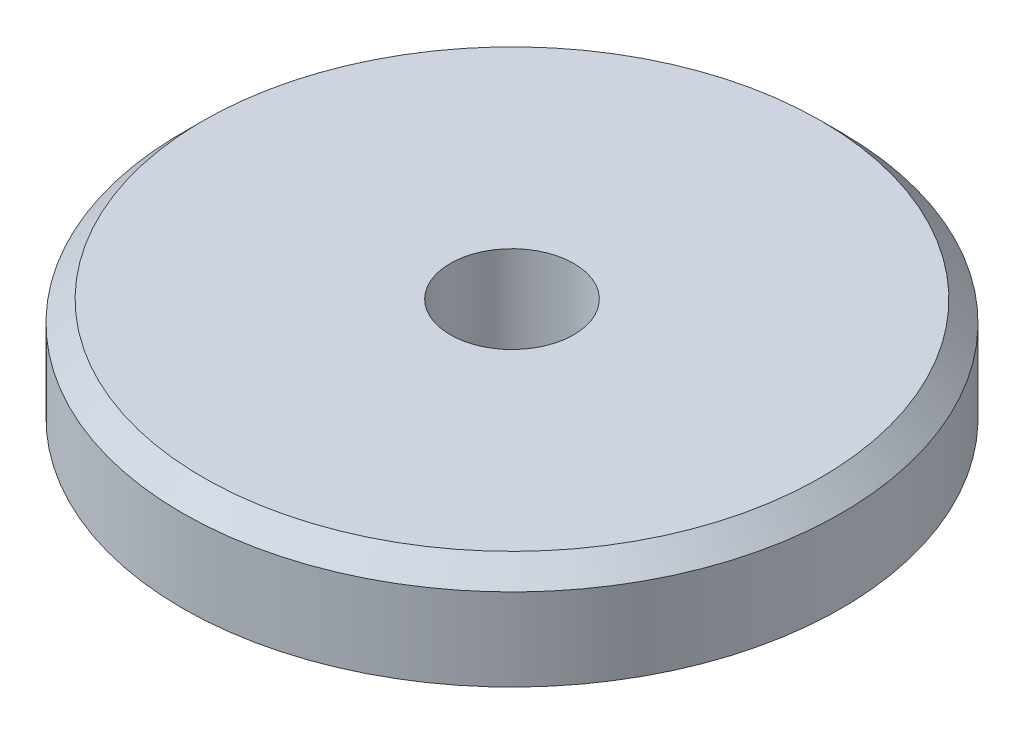
ISO-10303-21;
HEADER;
FILE_DESCRIPTION(('STEP AP214'),'2;1');
FILE_NAME('part.step','',(''),(''),'','','');
FILE_SCHEMA(('AUTOMOTIVE_DESIGN { 1 0 10303 214 1 1 1 1 }'));
ENDSEC;
DATA;
#1=APPLICATION_CONTEXT('core data for automotive mechanical design processes');
#2=APPLICATION_PROTOCOL_DEFINITION('international standard','automotive_design',2000,#1);
#3=PRODUCT_CONTEXT('',#1,'mechanical');
#4=PRODUCT('Part','Part','',(#3));
#5=PRODUCT_RELATED_PRODUCT_CATEGORY('part','',(#4));
#6=PRODUCT_DEFINITION_FORMATION('','',#4);
#7=PRODUCT_DEFINITION_CONTEXT('part definition',#1,'design');
#8=PRODUCT_DEFINITION('design','',#6,#7);
#9=PRODUCT_DEFINITION_SHAPE('','',#8);
#10=(LENGTH_UNIT() NAMED_UNIT(*) SI_UNIT(.MILLI.,.METRE.));
#11=(NAMED_UNIT(*) PLANE_ANGLE_UNIT() SI_UNIT($,.RADIAN.));
#12=(NAMED_UNIT(*) SI_UNIT($,.STERADIAN.) SOLID_ANGLE_UNIT());
#13=UNCERTAINTY_MEASURE_WITH_UNIT(LENGTH_MEASURE(1.E-05),#10,'distance_accuracy_value','');
#14=(GEOMETRIC_REPRESENTATION_CONTEXT(3) GLOBAL_UNCERTAINTY_ASSIGNED_CONTEXT((#13)) GLOBAL_UNIT_ASSIGNED_CONTEXT((#10,
#11,#12)) REPRESENTATION_CONTEXT('',''));
#15=CARTESIAN_POINT('',(0.,0.,0.));
#16=DIRECTION('',(0.,0.,1.));
#17=DIRECTION('',(1.,0.,0.));
#18=AXIS2_PLACEMENT_3D('',#15,#16,#17);
#19=CARTESIAN_POINT('',(0.,0.,0.));
#20=DIRECTION('',(0.,-1.,0.));
#21=DIRECTION('',(0.,0.,-1.));
#22=AXIS2_PLACEMENT_3D('',#19,#20,#21);
#23=CYLINDRICAL_SURFACE('',#22,16.);
#24=CARTESIAN_POINT('',(0.,-1.06915164798487,0.));
#25=DIRECTION('',(0.,-1.,0.));
#26=DIRECTION('',(0.,0.,-1.));
#27=AXIS2_PLACEMENT_3D('',#24,#25,#26);
#28=CIRCLE('',#27,16.);
#29=CARTESIAN_POINT('',(0.,-1.06915164798487,-16.));
#30=VERTEX_POINT('',#29);
#31=EDGE_CURVE('E52',#30,#30,#28,.T.);
#32=ORIENTED_EDGE('',*,*,#31,.F.);
#33=EDGE_LOOP('',(#32));
#34=FACE_BOUND('',#33,.T.);
#35=CARTESIAN_POINT('',(0.,2.93084835201513,0.));
#36=DIRECTION('',(0.,-1.,0.));
#37=DIRECTION('',(0.,0.,-1.));
#38=AXIS2_PLACEMENT_3D('',#35,#36,#37);
#39=CIRCLE('',#38,16.);
#40=CARTESIAN_POINT('',(0.,2.93084835201513,-16.));
#41=VERTEX_POINT('',#40);
#42=EDGE_CURVE('E10',#41,#41,#39,.T.);
#43=ORIENTED_EDGE('',*,*,#42,.T.);
#44=EDGE_LOOP('',(#43));
#45=FACE_BOUND('',#44,.T.);
#46=ADVANCED_FACE('F33',(#34,#45),#23,.T.);
#47=CARTESIAN_POINT('',(0.,3.93084835201512,0.));
#48=DIRECTION('',(0.,-1.,0.));
#49=DIRECTION('',(0.,0.,-1.));
#50=AXIS2_PLACEMENT_3D('',#47,#48,#49);
#51=CONICAL_SURFACE('',#50,15.,0.785398163397447);
#52=ORIENTED_EDGE('',*,*,#42,.F.);
#53=EDGE_LOOP('',(#52));
#54=FACE_BOUND('',#53,.T.);
#55=CARTESIAN_POINT('',(0.,3.93084835201512,0.));
#56=DIRECTION('',(0.,-1.,0.));
#57=DIRECTION('',(0.,0.,-1.));
#58=AXIS2_PLACEMENT_3D('',#55,#56,#57);
#59=CIRCLE('',#58,15.);
#60=CARTESIAN_POINT('',(0.,3.93084835201512,-15.));
#61=VERTEX_POINT('',#60);
#62=EDGE_CURVE('E39',#61,#61,#59,.T.);
#63=ORIENTED_EDGE('',*,*,#62,.T.);
#64=EDGE_LOOP('',(#63));
#65=FACE_BOUND('',#64,.T.);
#66=ADVANCED_FACE('F59',(#54,#65),#51,.T.);
#67=CARTESIAN_POINT('',(-15.,3.93084835201512,0.));
#68=DIRECTION('',(0.,-1.,0.));
#69=DIRECTION('',(0.,0.,-1.));
#70=AXIS2_PLACEMENT_3D('',#67,#68,#69);
#71=PLANE('',#70);
#72=ORIENTED_EDGE('',*,*,#62,.F.);
#73=EDGE_LOOP('',(#72));
#74=FACE_BOUND('',#73,.T.);
#75=CARTESIAN_POINT('',(0.,3.93084835201513,0.));
#76=DIRECTION('',(0.,-1.,0.));
#77=DIRECTION('',(0.,0.,-1.));
#78=AXIS2_PLACEMENT_3D('',#75,#76,#77);
#79=CIRCLE('',#78,3.);
#80=CARTESIAN_POINT('',(0.,3.93084835201513,-3.));
#81=VERTEX_POINT('',#80);
#82=EDGE_CURVE('E43',#81,#81,#79,.T.);
#83=ORIENTED_EDGE('',*,*,#82,.T.);
#84=EDGE_LOOP('',(#83));
#85=FACE_BOUND('',#84,.T.);
#86=ADVANCED_FACE('F63',(#74,#85),#71,.F.);
#87=CARTESIAN_POINT('',(0.,0.,0.));
#88=DIRECTION('',(0.,-1.,0.));
#89=DIRECTION('',(0.,0.,-1.));
#90=AXIS2_PLACEMENT_3D('',#87,#88,#89);
#91=CYLINDRICAL_SURFACE('',#90,3.);
#92=ORIENTED_EDGE('',*,*,#82,.F.);
#93=EDGE_LOOP('',(#92));
#94=FACE_BOUND('',#93,.T.);
#95=CARTESIAN_POINT('',(0.,-1.06915164798487,0.));
#96=DIRECTION('',(0.,-1.,0.));
#97=DIRECTION('',(0.,0.,-1.));
#98=AXIS2_PLACEMENT_3D('',#95,#96,#97);
#99=CIRCLE('',#98,3.);
#100=CARTESIAN_POINT('',(0.,-1.06915164798487,-3.));
#101=VERTEX_POINT('',#100);
#102=EDGE_CURVE('E47',#101,#101,#99,.T.);
#103=ORIENTED_EDGE('',*,*,#102,.T.);
#104=EDGE_LOOP('',(#103));
#105=FACE_BOUND('',#104,.T.);
#106=ADVANCED_FACE('F68',(#94,#105),#91,.F.);
#107=CARTESIAN_POINT('',(-3.,-1.06915164798487,0.));
#108=DIRECTION('',(0.,1.,0.));
#109=DIRECTION('',(0.,0.,1.));
#110=AXIS2_PLACEMENT_3D('',#107,#108,#109);
#111=PLANE('',#110);
#112=ORIENTED_EDGE('',*,*,#102,.F.);
#113=EDGE_LOOP('',(#112));
#114=FACE_BOUND('',#113,.T.);
#115=ORIENTED_EDGE('',*,*,#31,.T.);
#116=EDGE_LOOP('',(#115));
#117=FACE_BOUND('',#116,.T.);
#118=ADVANCED_FACE('F56',(#114,#117),#111,.F.);
#119=CLOSED_SHELL('',(#46,#66,#86,#106,#118));
#120=MANIFOLD_SOLID_BREP('B2',#119);
#121=ADVANCED_BREP_SHAPE_REPRESENTATION('',(#18,#120),#14);
#122=SHAPE_DEFINITION_REPRESENTATION(#9,#121);
ENDSEC;
END-ISO-10303-21;
